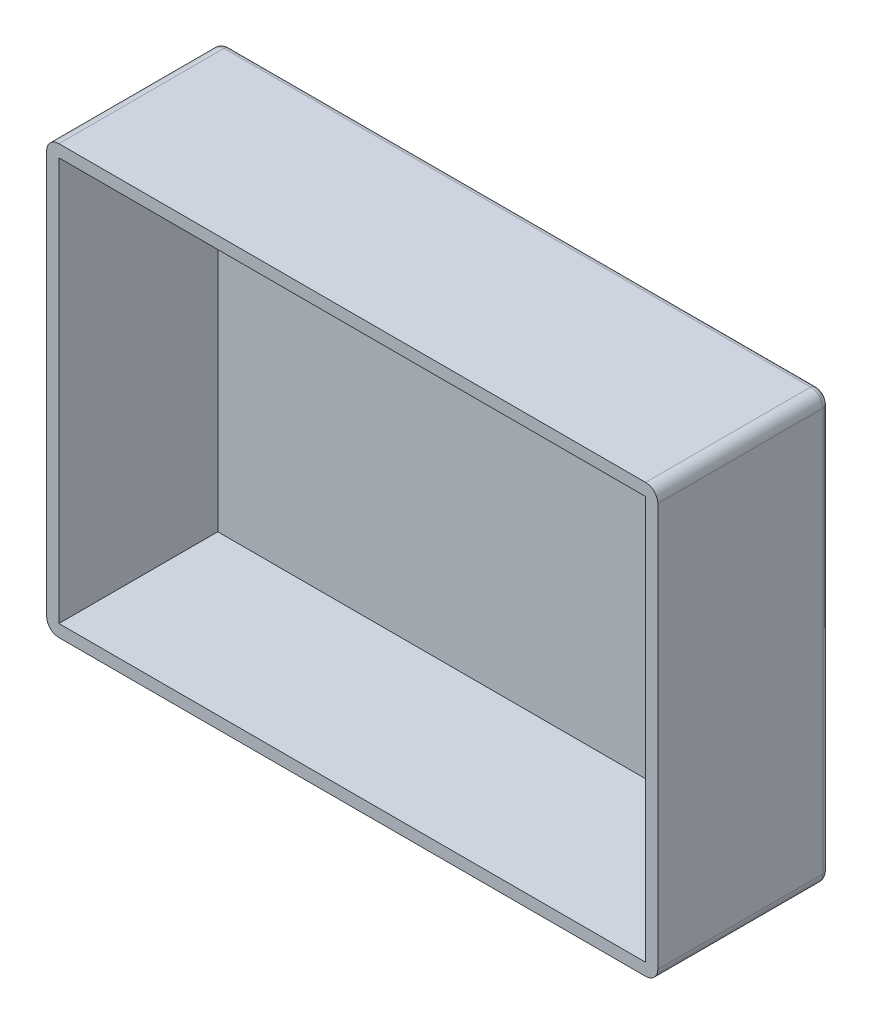
ISO-10303-21;
HEADER;
FILE_DESCRIPTION(('STEP AP214'),'2;1');
FILE_NAME('part.step','',(''),(''),'','','');
FILE_SCHEMA(('AUTOMOTIVE_DESIGN { 1 0 10303 214 1 1 1 1 }'));
ENDSEC;
DATA;
#1=APPLICATION_CONTEXT('core data for automotive mechanical design processes');
#2=APPLICATION_PROTOCOL_DEFINITION('international standard','automotive_design',2000,#1);
#3=PRODUCT_CONTEXT('',#1,'mechanical');
#4=PRODUCT('Part','Part','',(#3));
#5=PRODUCT_RELATED_PRODUCT_CATEGORY('part','',(#4));
#6=PRODUCT_DEFINITION_FORMATION('','',#4);
#7=PRODUCT_DEFINITION_CONTEXT('part definition',#1,'design');
#8=PRODUCT_DEFINITION('design','',#6,#7);
#9=PRODUCT_DEFINITION_SHAPE('','',#8);
#10=(LENGTH_UNIT() NAMED_UNIT(*) SI_UNIT(.MILLI.,.METRE.));
#11=(NAMED_UNIT(*) PLANE_ANGLE_UNIT() SI_UNIT($,.RADIAN.));
#12=(NAMED_UNIT(*) SI_UNIT($,.STERADIAN.) SOLID_ANGLE_UNIT());
#13=UNCERTAINTY_MEASURE_WITH_UNIT(LENGTH_MEASURE(1.E-05),#10,'distance_accuracy_value','');
#14=(GEOMETRIC_REPRESENTATION_CONTEXT(3) GLOBAL_UNCERTAINTY_ASSIGNED_CONTEXT((#13)) GLOBAL_UNIT_ASSIGNED_CONTEXT((#10,
#11,#12)) REPRESENTATION_CONTEXT('',''));
#15=CARTESIAN_POINT('',(0.,0.,0.));
#16=DIRECTION('',(0.,0.,1.));
#17=DIRECTION('',(1.,0.,0.));
#18=AXIS2_PLACEMENT_3D('',#15,#16,#17);
#19=CARTESIAN_POINT('',(250.,175.,140.));
#20=DIRECTION('',(-1.,0.,0.));
#21=DIRECTION('',(0.,-1.,0.));
#22=AXIS2_PLACEMENT_3D('',#19,#20,#21);
#23=PLANE('',#22);
#24=DIRECTION('',(0.,0.,-1.));
#25=VECTOR('',#24,1.);
#26=CARTESIAN_POINT('',(250.,-165.,140.));
#27=LINE('',#26,#25);
#28=CARTESIAN_POINT('',(250.,-165.,140.));
#29=VERTEX_POINT('',#28);
#30=CARTESIAN_POINT('',(250.,-165.,5.));
#31=VERTEX_POINT('',#30);
#32=EDGE_CURVE('E207',#29,#31,#27,.T.);
#33=ORIENTED_EDGE('',*,*,#32,.T.);
#34=DIRECTION('',(0.,1.,0.));
#35=VECTOR('',#34,1.);
#36=CARTESIAN_POINT('',(250.,175.,5.));
#37=LINE('',#36,#35);
#38=CARTESIAN_POINT('',(250.,165.,5.));
#39=VERTEX_POINT('',#38);
#40=EDGE_CURVE('E249',#31,#39,#37,.T.);
#41=ORIENTED_EDGE('',*,*,#40,.T.);
#42=DIRECTION('',(0.,0.,-1.));
#43=VECTOR('',#42,1.);
#44=CARTESIAN_POINT('',(250.,165.,140.));
#45=LINE('',#44,#43);
#46=CARTESIAN_POINT('',(250.,165.,140.));
#47=VERTEX_POINT('',#46);
#48=EDGE_CURVE('E210',#39,#47,#45,.F.);
#49=ORIENTED_EDGE('',*,*,#48,.T.);
#50=DIRECTION('',(0.,1.,0.));
#51=VECTOR('',#50,1.);
#52=CARTESIAN_POINT('',(250.,175.,140.));
#53=LINE('',#52,#51);
#54=EDGE_CURVE('E188',#29,#47,#53,.T.);
#55=ORIENTED_EDGE('',*,*,#54,.F.);
#56=EDGE_LOOP('',(#33,#41,#49,#55));
#57=FACE_BOUND('',#56,.T.);
#58=ADVANCED_FACE('F35',(#57),#23,.F.);
#59=CARTESIAN_POINT('',(-250.,175.,140.));
#60=DIRECTION('',(0.,-1.,0.));
#61=DIRECTION('',(0.,0.,-1.));
#62=AXIS2_PLACEMENT_3D('',#59,#60,#61);
#63=PLANE('',#62);
#64=DIRECTION('',(0.,0.,-1.));
#65=VECTOR('',#64,1.);
#66=CARTESIAN_POINT('',(240.,175.,140.));
#67=LINE('',#66,#65);
#68=CARTESIAN_POINT('',(240.,175.,140.));
#69=VERTEX_POINT('',#68);
#70=CARTESIAN_POINT('',(240.,175.,5.));
#71=VERTEX_POINT('',#70);
#72=EDGE_CURVE('E205',#69,#71,#67,.T.);
#73=ORIENTED_EDGE('',*,*,#72,.T.);
#74=DIRECTION('',(-1.,0.,0.));
#75=VECTOR('',#74,1.);
#76=CARTESIAN_POINT('',(-250.,175.,5.));
#77=LINE('',#76,#75);
#78=CARTESIAN_POINT('',(-240.,175.,5.));
#79=VERTEX_POINT('',#78);
#80=EDGE_CURVE('E11',#71,#79,#77,.T.);
#81=ORIENTED_EDGE('',*,*,#80,.T.);
#82=DIRECTION('',(0.,0.,-1.));
#83=VECTOR('',#82,1.);
#84=CARTESIAN_POINT('',(-240.,175.,140.));
#85=LINE('',#84,#83);
#86=CARTESIAN_POINT('',(-240.,175.,140.));
#87=VERTEX_POINT('',#86);
#88=EDGE_CURVE('E203',#79,#87,#85,.F.);
#89=ORIENTED_EDGE('',*,*,#88,.T.);
#90=DIRECTION('',(-1.,0.,0.));
#91=VECTOR('',#90,1.);
#92=CARTESIAN_POINT('',(-250.,175.,140.));
#93=LINE('',#92,#91);
#94=EDGE_CURVE('E194',#69,#87,#93,.T.);
#95=ORIENTED_EDGE('',*,*,#94,.F.);
#96=EDGE_LOOP('',(#73,#81,#89,#95));
#97=FACE_BOUND('',#96,.T.);
#98=ADVANCED_FACE('F330',(#97),#63,.F.);
#99=CARTESIAN_POINT('',(-250.,175.,140.));
#100=DIRECTION('',(1.,0.,0.));
#101=DIRECTION('',(0.,0.,-1.));
#102=AXIS2_PLACEMENT_3D('',#99,#100,#101);
#103=PLANE('',#102);
#104=DIRECTION('',(0.,0.,-1.));
#105=VECTOR('',#104,1.);
#106=CARTESIAN_POINT('',(-250.,165.,140.));
#107=LINE('',#106,#105);
#108=CARTESIAN_POINT('',(-250.,165.,140.));
#109=VERTEX_POINT('',#108);
#110=CARTESIAN_POINT('',(-250.,165.,5.));
#111=VERTEX_POINT('',#110);
#112=EDGE_CURVE('E227',#109,#111,#107,.T.);
#113=ORIENTED_EDGE('',*,*,#112,.T.);
#114=DIRECTION('',(0.,-1.,0.));
#115=VECTOR('',#114,1.);
#116=CARTESIAN_POINT('',(-250.,175.,5.));
#117=LINE('',#116,#115);
#118=CARTESIAN_POINT('',(-250.,-165.,5.));
#119=VERTEX_POINT('',#118);
#120=EDGE_CURVE('E257',#111,#119,#117,.T.);
#121=ORIENTED_EDGE('',*,*,#120,.T.);
#122=DIRECTION('',(0.,0.,-1.));
#123=VECTOR('',#122,1.);
#124=CARTESIAN_POINT('',(-250.,-165.,140.));
#125=LINE('',#124,#123);
#126=CARTESIAN_POINT('',(-250.,-165.,140.));
#127=VERTEX_POINT('',#126);
#128=EDGE_CURVE('E225',#119,#127,#125,.F.);
#129=ORIENTED_EDGE('',*,*,#128,.T.);
#130=DIRECTION('',(0.,-1.,0.));
#131=VECTOR('',#130,1.);
#132=CARTESIAN_POINT('',(-250.,175.,140.));
#133=LINE('',#132,#131);
#134=EDGE_CURVE('E197',#109,#127,#133,.T.);
#135=ORIENTED_EDGE('',*,*,#134,.F.);
#136=EDGE_LOOP('',(#113,#121,#129,#135));
#137=FACE_BOUND('',#136,.T.);
#138=ADVANCED_FACE('F335',(#137),#103,.F.);
#139=CARTESIAN_POINT('',(-250.,-175.,140.));
#140=DIRECTION('',(0.,1.,0.));
#141=DIRECTION('',(0.,0.,1.));
#142=AXIS2_PLACEMENT_3D('',#139,#140,#141);
#143=PLANE('',#142);
#144=DIRECTION('',(0.,0.,-1.));
#145=VECTOR('',#144,1.);
#146=CARTESIAN_POINT('',(-240.,-175.,140.));
#147=LINE('',#146,#145);
#148=CARTESIAN_POINT('',(-240.,-175.,140.));
#149=VERTEX_POINT('',#148);
#150=CARTESIAN_POINT('',(-240.,-175.,5.));
#151=VERTEX_POINT('',#150);
#152=EDGE_CURVE('E220',#149,#151,#147,.T.);
#153=ORIENTED_EDGE('',*,*,#152,.T.);
#154=DIRECTION('',(1.,0.,0.));
#155=VECTOR('',#154,1.);
#156=CARTESIAN_POINT('',(-250.,-175.,5.));
#157=LINE('',#156,#155);
#158=CARTESIAN_POINT('',(240.,-175.,5.));
#159=VERTEX_POINT('',#158);
#160=EDGE_CURVE('E253',#151,#159,#157,.T.);
#161=ORIENTED_EDGE('',*,*,#160,.T.);
#162=DIRECTION('',(0.,0.,-1.));
#163=VECTOR('',#162,1.);
#164=CARTESIAN_POINT('',(240.,-175.,140.));
#165=LINE('',#164,#163);
#166=CARTESIAN_POINT('',(240.,-175.,140.));
#167=VERTEX_POINT('',#166);
#168=EDGE_CURVE('E223',#159,#167,#165,.F.);
#169=ORIENTED_EDGE('',*,*,#168,.T.);
#170=DIRECTION('',(1.,0.,0.));
#171=VECTOR('',#170,1.);
#172=CARTESIAN_POINT('',(-250.,-175.,140.));
#173=LINE('',#172,#171);
#174=EDGE_CURVE('E200',#149,#167,#173,.T.);
#175=ORIENTED_EDGE('',*,*,#174,.F.);
#176=EDGE_LOOP('',(#153,#161,#169,#175));
#177=FACE_BOUND('',#176,.T.);
#178=ADVANCED_FACE('F298',(#177),#143,.F.);
#179=CARTESIAN_POINT('',(0.,0.,140.));
#180=DIRECTION('',(0.,0.,1.));
#181=DIRECTION('',(1.,0.,0.));
#182=AXIS2_PLACEMENT_3D('',#179,#180,#181);
#183=PLANE('',#182);
#184=DIRECTION('',(0.,1.,0.));
#185=VECTOR('',#184,1.);
#186=CARTESIAN_POINT('',(240.,165.,140.));
#187=LINE('',#186,#185);
#188=CARTESIAN_POINT('',(240.,-165.,140.));
#189=VERTEX_POINT('',#188);
#190=CARTESIAN_POINT('',(240.,165.,140.));
#191=VERTEX_POINT('',#190);
#192=EDGE_CURVE('E156',#189,#191,#187,.T.);
#193=ORIENTED_EDGE('',*,*,#192,.F.);
#194=DIRECTION('',(1.,0.,0.));
#195=VECTOR('',#194,1.);
#196=CARTESIAN_POINT('',(-240.,-165.,140.));
#197=LINE('',#196,#195);
#198=CARTESIAN_POINT('',(-240.,-165.,140.));
#199=VERTEX_POINT('',#198);
#200=EDGE_CURVE('E173',#199,#189,#197,.T.);
#201=ORIENTED_EDGE('',*,*,#200,.F.);
#202=DIRECTION('',(0.,-1.,0.));
#203=VECTOR('',#202,1.);
#204=CARTESIAN_POINT('',(-240.,165.,140.));
#205=LINE('',#204,#203);
#206=CARTESIAN_POINT('',(-240.,165.,140.));
#207=VERTEX_POINT('',#206);
#208=EDGE_CURVE('E176',#207,#199,#205,.T.);
#209=ORIENTED_EDGE('',*,*,#208,.F.);
#210=DIRECTION('',(-1.,0.,0.));
#211=VECTOR('',#210,1.);
#212=CARTESIAN_POINT('',(-240.,165.,140.));
#213=LINE('',#212,#211);
#214=EDGE_CURVE('E182',#191,#207,#213,.T.);
#215=ORIENTED_EDGE('',*,*,#214,.F.);
#216=EDGE_LOOP('',(#193,#201,#209,#215));
#217=FACE_BOUND('',#216,.T.);
#218=ORIENTED_EDGE('',*,*,#54,.T.);
#219=CARTESIAN_POINT('',(240.,165.,140.));
#220=DIRECTION('',(0.,0.,1.));
#221=DIRECTION('',(1.,0.,0.));
#222=AXIS2_PLACEMENT_3D('',#219,#220,#221);
#223=CIRCLE('',#222,10.);
#224=EDGE_CURVE('E218',#47,#69,#223,.T.);
#225=ORIENTED_EDGE('',*,*,#224,.T.);
#226=ORIENTED_EDGE('',*,*,#94,.T.);
#227=CARTESIAN_POINT('',(-240.,165.,140.));
#228=DIRECTION('',(0.,0.,1.));
#229=DIRECTION('',(1.,0.,0.));
#230=AXIS2_PLACEMENT_3D('',#227,#228,#229);
#231=CIRCLE('',#230,10.);
#232=EDGE_CURVE('E214',#87,#109,#231,.T.);
#233=ORIENTED_EDGE('',*,*,#232,.T.);
#234=ORIENTED_EDGE('',*,*,#134,.T.);
#235=CARTESIAN_POINT('',(-240.,-165.,140.));
#236=DIRECTION('',(0.,0.,1.));
#237=DIRECTION('',(1.,0.,0.));
#238=AXIS2_PLACEMENT_3D('',#235,#236,#237);
#239=CIRCLE('',#238,10.);
#240=EDGE_CURVE('E212',#127,#149,#239,.T.);
#241=ORIENTED_EDGE('',*,*,#240,.T.);
#242=ORIENTED_EDGE('',*,*,#174,.T.);
#243=CARTESIAN_POINT('',(240.,-165.,140.));
#244=DIRECTION('',(0.,0.,1.));
#245=DIRECTION('',(1.,0.,0.));
#246=AXIS2_PLACEMENT_3D('',#243,#244,#245);
#247=CIRCLE('',#246,10.);
#248=EDGE_CURVE('E216',#167,#29,#247,.T.);
#249=ORIENTED_EDGE('',*,*,#248,.T.);
#250=EDGE_LOOP('',(#218,#225,#226,#233,#234,#241,#242,#249));
#251=FACE_BOUND('',#250,.T.);
#252=ADVANCED_FACE('F302',(#217,#251),#183,.T.);
#253=CARTESIAN_POINT('',(0.,0.,0.));
#254=DIRECTION('',(0.,0.,1.));
#255=DIRECTION('',(1.,0.,0.));
#256=AXIS2_PLACEMENT_3D('',#253,#254,#255);
#257=PLANE('',#256);
#258=DIRECTION('',(-1.,0.,0.));
#259=VECTOR('',#258,1.);
#260=CARTESIAN_POINT('',(0.,170.,0.));
#261=LINE('',#260,#259);
#262=CARTESIAN_POINT('',(-240.,170.,0.));
#263=VERTEX_POINT('',#262);
#264=CARTESIAN_POINT('',(240.,170.,0.));
#265=VERTEX_POINT('',#264);
#266=EDGE_CURVE('E229',#263,#265,#261,.F.);
#267=ORIENTED_EDGE('',*,*,#266,.T.);
#268=CARTESIAN_POINT('',(240.,165.,0.));
#269=DIRECTION('',(0.,0.,1.));
#270=DIRECTION('',(1.,0.,0.));
#271=AXIS2_PLACEMENT_3D('',#268,#269,#270);
#272=CIRCLE('',#271,5.);
#273=CARTESIAN_POINT('',(245.,165.,0.));
#274=VERTEX_POINT('',#273);
#275=EDGE_CURVE('E243',#265,#274,#272,.F.);
#276=ORIENTED_EDGE('',*,*,#275,.T.);
#277=DIRECTION('',(0.,1.,0.));
#278=VECTOR('',#277,1.);
#279=CARTESIAN_POINT('',(245.,0.,0.));
#280=LINE('',#279,#278);
#281=CARTESIAN_POINT('',(245.,-165.,0.));
#282=VERTEX_POINT('',#281);
#283=EDGE_CURVE('E241',#274,#282,#280,.F.);
#284=ORIENTED_EDGE('',*,*,#283,.T.);
#285=CARTESIAN_POINT('',(240.,-165.,0.));
#286=DIRECTION('',(0.,0.,1.));
#287=DIRECTION('',(1.,0.,0.));
#288=AXIS2_PLACEMENT_3D('',#285,#286,#287);
#289=CIRCLE('',#288,5.);
#290=CARTESIAN_POINT('',(240.,-170.,0.));
#291=VERTEX_POINT('',#290);
#292=EDGE_CURVE('E239',#282,#291,#289,.F.);
#293=ORIENTED_EDGE('',*,*,#292,.T.);
#294=DIRECTION('',(1.,0.,0.));
#295=VECTOR('',#294,1.);
#296=CARTESIAN_POINT('',(0.,-170.,0.));
#297=LINE('',#296,#295);
#298=CARTESIAN_POINT('',(-240.,-170.,0.));
#299=VERTEX_POINT('',#298);
#300=EDGE_CURVE('E237',#291,#299,#297,.F.);
#301=ORIENTED_EDGE('',*,*,#300,.T.);
#302=CARTESIAN_POINT('',(-240.,-165.,0.));
#303=DIRECTION('',(0.,0.,1.));
#304=DIRECTION('',(1.,0.,0.));
#305=AXIS2_PLACEMENT_3D('',#302,#303,#304);
#306=CIRCLE('',#305,5.);
#307=CARTESIAN_POINT('',(-245.,-165.,0.));
#308=VERTEX_POINT('',#307);
#309=EDGE_CURVE('E235',#299,#308,#306,.F.);
#310=ORIENTED_EDGE('',*,*,#309,.T.);
#311=DIRECTION('',(0.,-1.,0.));
#312=VECTOR('',#311,1.);
#313=CARTESIAN_POINT('',(-245.,0.,0.));
#314=LINE('',#313,#312);
#315=CARTESIAN_POINT('',(-245.,165.,0.));
#316=VERTEX_POINT('',#315);
#317=EDGE_CURVE('E233',#308,#316,#314,.F.);
#318=ORIENTED_EDGE('',*,*,#317,.T.);
#319=CARTESIAN_POINT('',(-240.,165.,0.));
#320=DIRECTION('',(0.,0.,1.));
#321=DIRECTION('',(1.,0.,0.));
#322=AXIS2_PLACEMENT_3D('',#319,#320,#321);
#323=CIRCLE('',#322,5.);
#324=EDGE_CURVE('E231',#316,#263,#323,.F.);
#325=ORIENTED_EDGE('',*,*,#324,.T.);
#326=EDGE_LOOP('',(#267,#276,#284,#293,#301,#310,#318,#325));
#327=FACE_BOUND('',#326,.T.);
#328=ADVANCED_FACE('F431',(#327),#257,.F.);
#329=CARTESIAN_POINT('',(240.,165.,10.));
#330=DIRECTION('',(1.,0.,0.));
#331=DIRECTION('',(0.,0.,-1.));
#332=AXIS2_PLACEMENT_3D('',#329,#330,#331);
#333=PLANE('',#332);
#334=ORIENTED_EDGE('',*,*,#192,.T.);
#335=DIRECTION('',(0.,0.,1.));
#336=VECTOR('',#335,1.);
#337=CARTESIAN_POINT('',(240.,165.,10.));
#338=LINE('',#337,#336);
#339=CARTESIAN_POINT('',(240.,165.,10.));
#340=VERTEX_POINT('',#339);
#341=EDGE_CURVE('E149',#340,#191,#338,.T.);
#342=ORIENTED_EDGE('',*,*,#341,.F.);
#343=DIRECTION('',(0.,1.,0.));
#344=VECTOR('',#343,1.);
#345=CARTESIAN_POINT('',(240.,165.,10.));
#346=LINE('',#345,#344);
#347=CARTESIAN_POINT('',(240.,-165.,10.));
#348=VERTEX_POINT('',#347);
#349=EDGE_CURVE('E153',#348,#340,#346,.T.);
#350=ORIENTED_EDGE('',*,*,#349,.F.);
#351=DIRECTION('',(0.,0.,1.));
#352=VECTOR('',#351,1.);
#353=CARTESIAN_POINT('',(240.,-165.,10.));
#354=LINE('',#353,#352);
#355=EDGE_CURVE('E186',#348,#189,#354,.T.);
#356=ORIENTED_EDGE('',*,*,#355,.T.);
#357=EDGE_LOOP('',(#334,#342,#350,#356));
#358=FACE_BOUND('',#357,.T.);
#359=ADVANCED_FACE('F151',(#358),#333,.F.);
#360=CARTESIAN_POINT('',(-240.,-165.,10.));
#361=DIRECTION('',(0.,-1.,0.));
#362=DIRECTION('',(0.,0.,-1.));
#363=AXIS2_PLACEMENT_3D('',#360,#361,#362);
#364=PLANE('',#363);
#365=ORIENTED_EDGE('',*,*,#200,.T.);
#366=ORIENTED_EDGE('',*,*,#355,.F.);
#367=DIRECTION('',(1.,0.,0.));
#368=VECTOR('',#367,1.);
#369=CARTESIAN_POINT('',(-240.,-165.,10.));
#370=LINE('',#369,#368);
#371=CARTESIAN_POINT('',(-240.,-165.,10.));
#372=VERTEX_POINT('',#371);
#373=EDGE_CURVE('E161',#372,#348,#370,.T.);
#374=ORIENTED_EDGE('',*,*,#373,.F.);
#375=DIRECTION('',(0.,0.,1.));
#376=VECTOR('',#375,1.);
#377=CARTESIAN_POINT('',(-240.,-165.,10.));
#378=LINE('',#377,#376);
#379=EDGE_CURVE('E189',#372,#199,#378,.T.);
#380=ORIENTED_EDGE('',*,*,#379,.T.);
#381=EDGE_LOOP('',(#365,#366,#374,#380));
#382=FACE_BOUND('',#381,.T.);
#383=ADVANCED_FACE('F416',(#382),#364,.F.);
#384=CARTESIAN_POINT('',(-240.,165.,10.));
#385=DIRECTION('',(-1.,0.,0.));
#386=DIRECTION('',(0.,0.,1.));
#387=AXIS2_PLACEMENT_3D('',#384,#385,#386);
#388=PLANE('',#387);
#389=ORIENTED_EDGE('',*,*,#208,.T.);
#390=ORIENTED_EDGE('',*,*,#379,.F.);
#391=DIRECTION('',(0.,-1.,0.));
#392=VECTOR('',#391,1.);
#393=CARTESIAN_POINT('',(-240.,165.,10.));
#394=LINE('',#393,#392);
#395=CARTESIAN_POINT('',(-240.,165.,10.));
#396=VERTEX_POINT('',#395);
#397=EDGE_CURVE('E169',#396,#372,#394,.T.);
#398=ORIENTED_EDGE('',*,*,#397,.F.);
#399=DIRECTION('',(0.,0.,1.));
#400=VECTOR('',#399,1.);
#401=CARTESIAN_POINT('',(-240.,165.,10.));
#402=LINE('',#401,#400);
#403=EDGE_CURVE('E160',#396,#207,#402,.T.);
#404=ORIENTED_EDGE('',*,*,#403,.T.);
#405=EDGE_LOOP('',(#389,#390,#398,#404));
#406=FACE_BOUND('',#405,.T.);
#407=ADVANCED_FACE('F409',(#406),#388,.F.);
#408=CARTESIAN_POINT('',(-240.,165.,10.));
#409=DIRECTION('',(0.,1.,0.));
#410=DIRECTION('',(0.,0.,1.));
#411=AXIS2_PLACEMENT_3D('',#408,#409,#410);
#412=PLANE('',#411);
#413=ORIENTED_EDGE('',*,*,#214,.T.);
#414=ORIENTED_EDGE('',*,*,#403,.F.);
#415=DIRECTION('',(-1.,0.,0.));
#416=VECTOR('',#415,1.);
#417=CARTESIAN_POINT('',(-240.,165.,10.));
#418=LINE('',#417,#416);
#419=EDGE_CURVE('E164',#340,#396,#418,.T.);
#420=ORIENTED_EDGE('',*,*,#419,.F.);
#421=ORIENTED_EDGE('',*,*,#341,.T.);
#422=EDGE_LOOP('',(#413,#414,#420,#421));
#423=FACE_BOUND('',#422,.T.);
#424=ADVANCED_FACE('F165',(#423),#412,.F.);
#425=CARTESIAN_POINT('',(0.,0.,10.));
#426=DIRECTION('',(0.,0.,1.));
#427=DIRECTION('',(1.,0.,0.));
#428=AXIS2_PLACEMENT_3D('',#425,#426,#427);
#429=PLANE('',#428);
#430=ORIENTED_EDGE('',*,*,#349,.T.);
#431=ORIENTED_EDGE('',*,*,#419,.T.);
#432=ORIENTED_EDGE('',*,*,#397,.T.);
#433=ORIENTED_EDGE('',*,*,#373,.T.);
#434=EDGE_LOOP('',(#430,#431,#432,#433));
#435=FACE_BOUND('',#434,.T.);
#436=ADVANCED_FACE('F171',(#435),#429,.T.);
#437=CARTESIAN_POINT('',(240.,165.,140.));
#438=DIRECTION('',(0.,0.,-1.));
#439=DIRECTION('',(-1.,0.,0.));
#440=AXIS2_PLACEMENT_3D('',#437,#438,#439);
#441=CYLINDRICAL_SURFACE('',#440,10.);
#442=ORIENTED_EDGE('',*,*,#48,.F.);
#443=CARTESIAN_POINT('',(240.,165.,5.));
#444=DIRECTION('',(0.,0.,1.));
#445=DIRECTION('',(1.,0.,0.));
#446=AXIS2_PLACEMENT_3D('',#443,#444,#445);
#447=CIRCLE('',#446,10.);
#448=EDGE_CURVE('E246',#39,#71,#447,.T.);
#449=ORIENTED_EDGE('',*,*,#448,.T.);
#450=ORIENTED_EDGE('',*,*,#72,.F.);
#451=ORIENTED_EDGE('',*,*,#224,.F.);
#452=EDGE_LOOP('',(#442,#449,#450,#451));
#453=FACE_BOUND('',#452,.T.);
#454=ADVANCED_FACE('F327',(#453),#441,.T.);
#455=CARTESIAN_POINT('',(240.,-165.,140.));
#456=DIRECTION('',(0.,0.,-1.));
#457=DIRECTION('',(-1.,0.,0.));
#458=AXIS2_PLACEMENT_3D('',#455,#456,#457);
#459=CYLINDRICAL_SURFACE('',#458,10.);
#460=ORIENTED_EDGE('',*,*,#168,.F.);
#461=CARTESIAN_POINT('',(240.,-165.,5.));
#462=DIRECTION('',(0.,0.,1.));
#463=DIRECTION('',(1.,0.,0.));
#464=AXIS2_PLACEMENT_3D('',#461,#462,#463);
#465=CIRCLE('',#464,10.);
#466=EDGE_CURVE('E251',#159,#31,#465,.T.);
#467=ORIENTED_EDGE('',*,*,#466,.T.);
#468=ORIENTED_EDGE('',*,*,#32,.F.);
#469=ORIENTED_EDGE('',*,*,#248,.F.);
#470=EDGE_LOOP('',(#460,#467,#468,#469));
#471=FACE_BOUND('',#470,.T.);
#472=ADVANCED_FACE('F306',(#471),#459,.T.);
#473=CARTESIAN_POINT('',(-240.,165.,140.));
#474=DIRECTION('',(0.,0.,-1.));
#475=DIRECTION('',(-1.,0.,0.));
#476=AXIS2_PLACEMENT_3D('',#473,#474,#475);
#477=CYLINDRICAL_SURFACE('',#476,10.);
#478=ORIENTED_EDGE('',*,*,#88,.F.);
#479=CARTESIAN_POINT('',(-240.,165.,5.));
#480=DIRECTION('',(0.,0.,1.));
#481=DIRECTION('',(1.,0.,0.));
#482=AXIS2_PLACEMENT_3D('',#479,#480,#481);
#483=CIRCLE('',#482,10.);
#484=EDGE_CURVE('E44',#79,#111,#483,.T.);
#485=ORIENTED_EDGE('',*,*,#484,.T.);
#486=ORIENTED_EDGE('',*,*,#112,.F.);
#487=ORIENTED_EDGE('',*,*,#232,.F.);
#488=EDGE_LOOP('',(#478,#485,#486,#487));
#489=FACE_BOUND('',#488,.T.);
#490=ADVANCED_FACE('F333',(#489),#477,.T.);
#491=CARTESIAN_POINT('',(-240.,-165.,140.));
#492=DIRECTION('',(0.,0.,-1.));
#493=DIRECTION('',(-1.,0.,0.));
#494=AXIS2_PLACEMENT_3D('',#491,#492,#493);
#495=CYLINDRICAL_SURFACE('',#494,10.);
#496=ORIENTED_EDGE('',*,*,#128,.F.);
#497=CARTESIAN_POINT('',(-240.,-165.,5.));
#498=DIRECTION('',(0.,0.,1.));
#499=DIRECTION('',(1.,0.,0.));
#500=AXIS2_PLACEMENT_3D('',#497,#498,#499);
#501=CIRCLE('',#500,10.);
#502=EDGE_CURVE('E255',#119,#151,#501,.T.);
#503=ORIENTED_EDGE('',*,*,#502,.T.);
#504=ORIENTED_EDGE('',*,*,#152,.F.);
#505=ORIENTED_EDGE('',*,*,#240,.F.);
#506=EDGE_LOOP('',(#496,#503,#504,#505));
#507=FACE_BOUND('',#506,.T.);
#508=ADVANCED_FACE('F294',(#507),#495,.T.);
#509=CARTESIAN_POINT('',(-240.,-165.,5.));
#510=DIRECTION('',(0.,0.,1.));
#511=DIRECTION('',(1.,0.,0.));
#512=AXIS2_PLACEMENT_3D('',#509,#510,#511);
#513=DEGENERATE_TOROIDAL_SURFACE('',#512,5.,5.,.T.);
#514=CARTESIAN_POINT('',(-240.,-170.,5.));
#515=DIRECTION('',(1.,0.,0.));
#516=DIRECTION('',(0.,0.,-1.));
#517=AXIS2_PLACEMENT_3D('',#514,#515,#516);
#518=CIRCLE('',#517,5.);
#519=EDGE_CURVE('E275',#151,#299,#518,.T.);
#520=ORIENTED_EDGE('',*,*,#519,.F.);
#521=ORIENTED_EDGE('',*,*,#502,.F.);
#522=CARTESIAN_POINT('',(-245.,-165.,5.));
#523=DIRECTION('',(0.,1.,0.));
#524=DIRECTION('',(0.,0.,1.));
#525=AXIS2_PLACEMENT_3D('',#522,#523,#524);
#526=CIRCLE('',#525,5.);
#527=EDGE_CURVE('E39',#308,#119,#526,.T.);
#528=ORIENTED_EDGE('',*,*,#527,.F.);
#529=ORIENTED_EDGE('',*,*,#309,.F.);
#530=EDGE_LOOP('',(#520,#521,#528,#529));
#531=FACE_BOUND('',#530,.T.);
#532=ADVANCED_FACE('F37',(#531),#513,.T.);
#533=CARTESIAN_POINT('',(-245.,175.,5.));
#534=DIRECTION('',(0.,-1.,0.));
#535=DIRECTION('',(0.,0.,-1.));
#536=AXIS2_PLACEMENT_3D('',#533,#534,#535);
#537=CYLINDRICAL_SURFACE('',#536,5.);
#538=ORIENTED_EDGE('',*,*,#527,.T.);
#539=ORIENTED_EDGE('',*,*,#120,.F.);
#540=CARTESIAN_POINT('',(-245.,165.,5.));
#541=DIRECTION('',(0.,1.,0.));
#542=DIRECTION('',(0.,0.,1.));
#543=AXIS2_PLACEMENT_3D('',#540,#541,#542);
#544=CIRCLE('',#543,5.);
#545=EDGE_CURVE('E273',#316,#111,#544,.T.);
#546=ORIENTED_EDGE('',*,*,#545,.F.);
#547=ORIENTED_EDGE('',*,*,#317,.F.);
#548=EDGE_LOOP('',(#538,#539,#546,#547));
#549=FACE_BOUND('',#548,.T.);
#550=ADVANCED_FACE('F286',(#549),#537,.T.);
#551=CARTESIAN_POINT('',(-250.,-170.,5.));
#552=DIRECTION('',(1.,0.,0.));
#553=DIRECTION('',(0.,0.,-1.));
#554=AXIS2_PLACEMENT_3D('',#551,#552,#553);
#555=CYLINDRICAL_SURFACE('',#554,5.);
#556=ORIENTED_EDGE('',*,*,#519,.T.);
#557=ORIENTED_EDGE('',*,*,#300,.F.);
#558=CARTESIAN_POINT('',(240.,-170.,5.));
#559=DIRECTION('',(1.,0.,0.));
#560=DIRECTION('',(0.,0.,-1.));
#561=AXIS2_PLACEMENT_3D('',#558,#559,#560);
#562=CIRCLE('',#561,5.);
#563=EDGE_CURVE('E270',#159,#291,#562,.T.);
#564=ORIENTED_EDGE('',*,*,#563,.F.);
#565=ORIENTED_EDGE('',*,*,#160,.F.);
#566=EDGE_LOOP('',(#556,#557,#564,#565));
#567=FACE_BOUND('',#566,.T.);
#568=ADVANCED_FACE('F370',(#567),#555,.T.);
#569=CARTESIAN_POINT('',(-240.,165.,5.));
#570=DIRECTION('',(0.,0.,1.));
#571=DIRECTION('',(1.,0.,0.));
#572=AXIS2_PLACEMENT_3D('',#569,#570,#571);
#573=DEGENERATE_TOROIDAL_SURFACE('',#572,5.,5.,.T.);
#574=ORIENTED_EDGE('',*,*,#545,.T.);
#575=ORIENTED_EDGE('',*,*,#484,.F.);
#576=CARTESIAN_POINT('',(-240.,170.,5.));
#577=DIRECTION('',(1.,0.,0.));
#578=DIRECTION('',(0.,0.,-1.));
#579=AXIS2_PLACEMENT_3D('',#576,#577,#578);
#580=CIRCLE('',#579,5.);
#581=EDGE_CURVE('E267',#263,#79,#580,.T.);
#582=ORIENTED_EDGE('',*,*,#581,.F.);
#583=ORIENTED_EDGE('',*,*,#324,.F.);
#584=EDGE_LOOP('',(#574,#575,#582,#583));
#585=FACE_BOUND('',#584,.T.);
#586=ADVANCED_FACE('F367',(#585),#573,.T.);
#587=CARTESIAN_POINT('',(240.,-165.,5.));
#588=DIRECTION('',(0.,0.,1.));
#589=DIRECTION('',(1.,0.,0.));
#590=AXIS2_PLACEMENT_3D('',#587,#588,#589);
#591=DEGENERATE_TOROIDAL_SURFACE('',#590,5.,5.,.T.);
#592=ORIENTED_EDGE('',*,*,#563,.T.);
#593=ORIENTED_EDGE('',*,*,#292,.F.);
#594=CARTESIAN_POINT('',(245.,-165.,5.));
#595=DIRECTION('',(0.,1.,0.));
#596=DIRECTION('',(0.,0.,1.));
#597=AXIS2_PLACEMENT_3D('',#594,#595,#596);
#598=CIRCLE('',#597,5.);
#599=EDGE_CURVE('E264',#31,#282,#598,.T.);
#600=ORIENTED_EDGE('',*,*,#599,.F.);
#601=ORIENTED_EDGE('',*,*,#466,.F.);
#602=EDGE_LOOP('',(#592,#593,#600,#601));
#603=FACE_BOUND('',#602,.T.);
#604=ADVANCED_FACE('F315',(#603),#591,.T.);
#605=CARTESIAN_POINT('',(-250.,170.,5.));
#606=DIRECTION('',(-1.,0.,0.));
#607=DIRECTION('',(0.,0.,1.));
#608=AXIS2_PLACEMENT_3D('',#605,#606,#607);
#609=CYLINDRICAL_SURFACE('',#608,5.);
#610=ORIENTED_EDGE('',*,*,#581,.T.);
#611=ORIENTED_EDGE('',*,*,#80,.F.);
#612=CARTESIAN_POINT('',(240.,170.,5.));
#613=DIRECTION('',(1.,0.,0.));
#614=DIRECTION('',(0.,0.,-1.));
#615=AXIS2_PLACEMENT_3D('',#612,#613,#614);
#616=CIRCLE('',#615,5.);
#617=EDGE_CURVE('E262',#265,#71,#616,.T.);
#618=ORIENTED_EDGE('',*,*,#617,.F.);
#619=ORIENTED_EDGE('',*,*,#266,.F.);
#620=EDGE_LOOP('',(#610,#611,#618,#619));
#621=FACE_BOUND('',#620,.T.);
#622=ADVANCED_FACE('F361',(#621),#609,.T.);
#623=CARTESIAN_POINT('',(245.,175.,5.));
#624=DIRECTION('',(0.,1.,0.));
#625=DIRECTION('',(-1.,0.,0.));
#626=AXIS2_PLACEMENT_3D('',#623,#624,#625);
#627=CYLINDRICAL_SURFACE('',#626,5.);
#628=ORIENTED_EDGE('',*,*,#599,.T.);
#629=ORIENTED_EDGE('',*,*,#283,.F.);
#630=CARTESIAN_POINT('',(245.,165.,5.));
#631=DIRECTION('',(0.,1.,0.));
#632=DIRECTION('',(0.,0.,1.));
#633=AXIS2_PLACEMENT_3D('',#630,#631,#632);
#634=CIRCLE('',#633,5.);
#635=EDGE_CURVE('E260',#39,#274,#634,.T.);
#636=ORIENTED_EDGE('',*,*,#635,.F.);
#637=ORIENTED_EDGE('',*,*,#40,.F.);
#638=EDGE_LOOP('',(#628,#629,#636,#637));
#639=FACE_BOUND('',#638,.T.);
#640=ADVANCED_FACE('F319',(#639),#627,.T.);
#641=CARTESIAN_POINT('',(240.,165.,5.));
#642=DIRECTION('',(0.,0.,1.));
#643=DIRECTION('',(1.,0.,0.));
#644=AXIS2_PLACEMENT_3D('',#641,#642,#643);
#645=DEGENERATE_TOROIDAL_SURFACE('',#644,5.,5.,.T.);
#646=ORIENTED_EDGE('',*,*,#617,.T.);
#647=ORIENTED_EDGE('',*,*,#448,.F.);
#648=ORIENTED_EDGE('',*,*,#635,.T.);
#649=ORIENTED_EDGE('',*,*,#275,.F.);
#650=EDGE_LOOP('',(#646,#647,#648,#649));
#651=FACE_BOUND('',#650,.T.);
#652=ADVANCED_FACE('F323',(#651),#645,.T.);
#653=CLOSED_SHELL('',(#58,#98,#138,#178,#252,#328,#359,#383,#407,#424,#436,#454,#472,#490,#508,
#532,#550,#568,#586,#604,#622,#640,#652));
#654=MANIFOLD_SOLID_BREP('B2',#653);
#655=ADVANCED_BREP_SHAPE_REPRESENTATION('',(#18,#654),#14);
#656=SHAPE_DEFINITION_REPRESENTATION(#9,#655);
ENDSEC;
END-ISO-10303-21;
